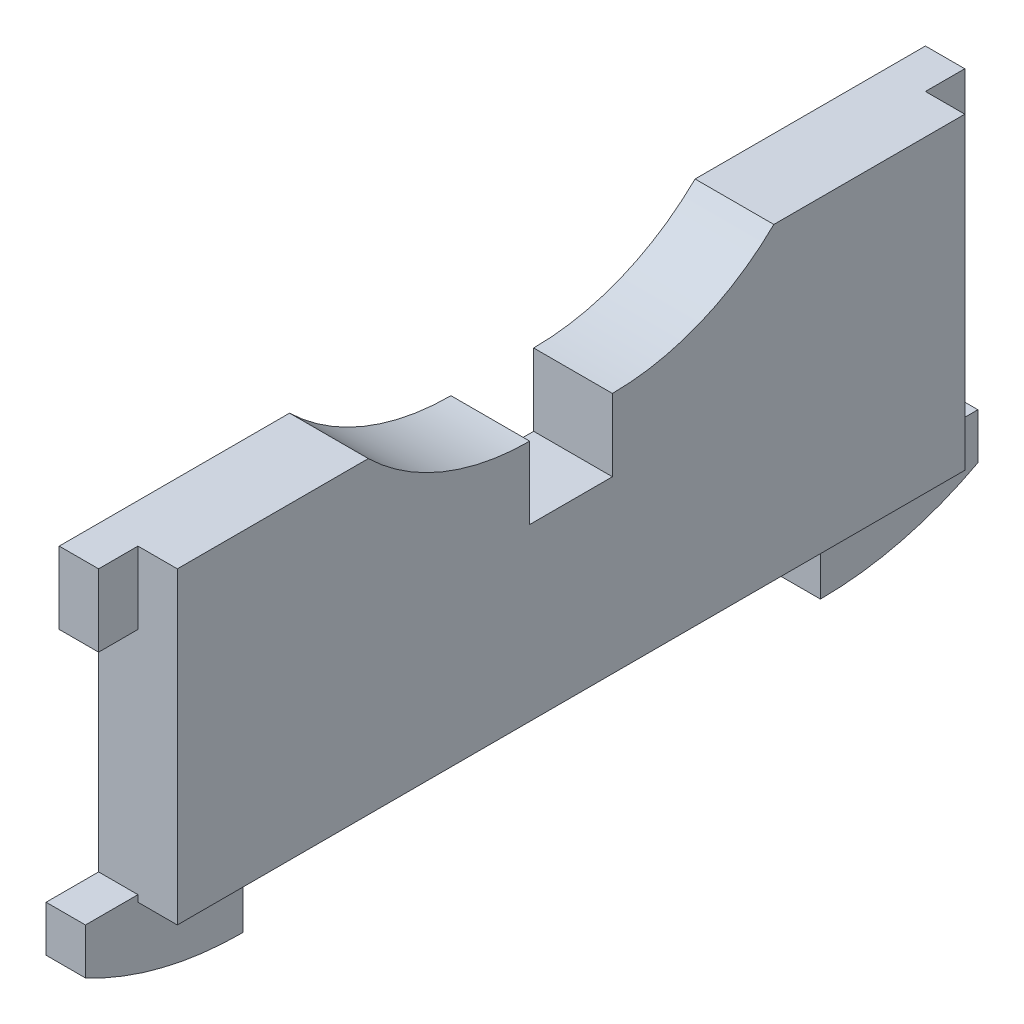
ISO-10303-21;
HEADER;
FILE_DESCRIPTION(('STEP AP214'),'2;1');
FILE_NAME('part.step','',(''),(''),'','','');
FILE_SCHEMA(('AUTOMOTIVE_DESIGN { 1 0 10303 214 1 1 1 1 }'));
ENDSEC;
DATA;
#1=APPLICATION_CONTEXT('core data for automotive mechanical design processes');
#2=APPLICATION_PROTOCOL_DEFINITION('international standard','automotive_design',2000,#1);
#3=PRODUCT_CONTEXT('',#1,'mechanical');
#4=PRODUCT('Part','Part','',(#3));
#5=PRODUCT_RELATED_PRODUCT_CATEGORY('part','',(#4));
#6=PRODUCT_DEFINITION_FORMATION('','',#4);
#7=PRODUCT_DEFINITION_CONTEXT('part definition',#1,'design');
#8=PRODUCT_DEFINITION('design','',#6,#7);
#9=PRODUCT_DEFINITION_SHAPE('','',#8);
#10=(LENGTH_UNIT() NAMED_UNIT(*) SI_UNIT(.MILLI.,.METRE.));
#11=(NAMED_UNIT(*) PLANE_ANGLE_UNIT() SI_UNIT($,.RADIAN.));
#12=(NAMED_UNIT(*) SI_UNIT($,.STERADIAN.) SOLID_ANGLE_UNIT());
#13=UNCERTAINTY_MEASURE_WITH_UNIT(LENGTH_MEASURE(1.E-05),#10,'distance_accuracy_value','');
#14=(GEOMETRIC_REPRESENTATION_CONTEXT(3) GLOBAL_UNCERTAINTY_ASSIGNED_CONTEXT((#13)) GLOBAL_UNIT_ASSIGNED_CONTEXT((#10,
#11,#12)) REPRESENTATION_CONTEXT('',''));
#15=CARTESIAN_POINT('',(0.,0.,0.));
#16=DIRECTION('',(0.,0.,1.));
#17=DIRECTION('',(1.,0.,0.));
#18=AXIS2_PLACEMENT_3D('',#15,#16,#17);
#19=CARTESIAN_POINT('',(3.,0.,-3.15));
#20=DIRECTION('',(0.,0.,-1.));
#21=DIRECTION('',(-1.,0.,0.));
#22=AXIS2_PLACEMENT_3D('',#19,#20,#21);
#23=PLANE('',#22);
#24=DIRECTION('',(-1.,0.,0.));
#25=VECTOR('',#24,1.);
#26=CARTESIAN_POINT('',(3.,5.50000000000001,-3.15));
#27=LINE('',#26,#25);
#28=CARTESIAN_POINT('',(3.,5.50000000000001,-3.15));
#29=VERTEX_POINT('',#28);
#30=CARTESIAN_POINT('',(-3.,5.50000000000001,-3.15));
#31=VERTEX_POINT('',#30);
#32=EDGE_CURVE('E562',#29,#31,#27,.T.);
#33=ORIENTED_EDGE('',*,*,#32,.T.);
#34=DIRECTION('',(0.,-1.,0.));
#35=VECTOR('',#34,1.);
#36=CARTESIAN_POINT('',(-3.,5.50000000000001,-3.15));
#37=LINE('',#36,#35);
#38=CARTESIAN_POINT('',(-3.,0.,-3.15));
#39=VERTEX_POINT('',#38);
#40=EDGE_CURVE('E488',#31,#39,#37,.T.);
#41=ORIENTED_EDGE('',*,*,#40,.T.);
#42=DIRECTION('',(-1.,0.,0.));
#43=VECTOR('',#42,1.);
#44=CARTESIAN_POINT('',(3.,0.,-3.15));
#45=LINE('',#44,#43);
#46=CARTESIAN_POINT('',(3.,0.,-3.15));
#47=VERTEX_POINT('',#46);
#48=EDGE_CURVE('E12',#47,#39,#45,.T.);
#49=ORIENTED_EDGE('',*,*,#48,.F.);
#50=DIRECTION('',(0.,-1.,0.));
#51=VECTOR('',#50,1.);
#52=CARTESIAN_POINT('',(3.,0.,-3.15));
#53=LINE('',#52,#51);
#54=EDGE_CURVE('E542',#29,#47,#53,.T.);
#55=ORIENTED_EDGE('',*,*,#54,.F.);
#56=EDGE_LOOP('',(#33,#41,#49,#55));
#57=FACE_BOUND('',#56,.T.);
#58=ADVANCED_FACE('F223',(#57),#23,.F.);
#59=CARTESIAN_POINT('',(3.,0.,3.15));
#60=DIRECTION('',(0.,-1.,0.));
#61=DIRECTION('',(0.,0.,-1.));
#62=AXIS2_PLACEMENT_3D('',#59,#60,#61);
#63=PLANE('',#62);
#64=ORIENTED_EDGE('',*,*,#48,.T.);
#65=DIRECTION('',(0.,0.,1.));
#66=VECTOR('',#65,1.);
#67=CARTESIAN_POINT('',(-3.,0.,-3.15));
#68=LINE('',#67,#66);
#69=CARTESIAN_POINT('',(-3.,0.,3.15));
#70=VERTEX_POINT('',#69);
#71=EDGE_CURVE('E491',#39,#70,#68,.T.);
#72=ORIENTED_EDGE('',*,*,#71,.T.);
#73=DIRECTION('',(-1.,0.,0.));
#74=VECTOR('',#73,1.);
#75=CARTESIAN_POINT('',(3.,0.,3.15));
#76=LINE('',#75,#74);
#77=CARTESIAN_POINT('',(3.,0.,3.15));
#78=VERTEX_POINT('',#77);
#79=EDGE_CURVE('E231',#78,#70,#76,.T.);
#80=ORIENTED_EDGE('',*,*,#79,.F.);
#81=DIRECTION('',(0.,0.,1.));
#82=VECTOR('',#81,1.);
#83=CARTESIAN_POINT('',(3.,0.,3.15));
#84=LINE('',#83,#82);
#85=EDGE_CURVE('E544',#47,#78,#84,.T.);
#86=ORIENTED_EDGE('',*,*,#85,.F.);
#87=EDGE_LOOP('',(#64,#72,#80,#86));
#88=FACE_BOUND('',#87,.T.);
#89=ADVANCED_FACE('F602',(#88),#63,.F.);
#90=CARTESIAN_POINT('',(3.,0.,3.15));
#91=DIRECTION('',(0.,0.,1.));
#92=DIRECTION('',(1.,0.,0.));
#93=AXIS2_PLACEMENT_3D('',#90,#91,#92);
#94=PLANE('',#93);
#95=ORIENTED_EDGE('',*,*,#79,.T.);
#96=DIRECTION('',(0.,1.,0.));
#97=VECTOR('',#96,1.);
#98=CARTESIAN_POINT('',(-3.,0.,3.15));
#99=LINE('',#98,#97);
#100=CARTESIAN_POINT('',(-3.,5.5,3.15));
#101=VERTEX_POINT('',#100);
#102=EDGE_CURVE('E494',#70,#101,#99,.T.);
#103=ORIENTED_EDGE('',*,*,#102,.T.);
#104=DIRECTION('',(-1.,0.,0.));
#105=VECTOR('',#104,1.);
#106=CARTESIAN_POINT('',(3.,5.5,3.15));
#107=LINE('',#106,#105);
#108=CARTESIAN_POINT('',(3.,5.5,3.15));
#109=VERTEX_POINT('',#108);
#110=EDGE_CURVE('E590',#109,#101,#107,.T.);
#111=ORIENTED_EDGE('',*,*,#110,.F.);
#112=DIRECTION('',(0.,1.,0.));
#113=VECTOR('',#112,1.);
#114=CARTESIAN_POINT('',(3.,0.,3.15));
#115=LINE('',#114,#113);
#116=EDGE_CURVE('E547',#78,#109,#115,.T.);
#117=ORIENTED_EDGE('',*,*,#116,.F.);
#118=EDGE_LOOP('',(#95,#103,#111,#117));
#119=FACE_BOUND('',#118,.T.);
#120=ADVANCED_FACE('F595',(#119),#94,.F.);
#121=CARTESIAN_POINT('',(3.,23.129,3.15));
#122=DIRECTION('',(-1.,0.,0.));
#123=DIRECTION('',(0.,0.,1.));
#124=AXIS2_PLACEMENT_3D('',#121,#122,#123);
#125=CYLINDRICAL_SURFACE('',#124,17.629);
#126=ORIENTED_EDGE('',*,*,#110,.T.);
#127=CARTESIAN_POINT('',(-3.,23.129,3.15));
#128=DIRECTION('',(-1.,0.,0.));
#129=DIRECTION('',(0.,0.,1.));
#130=AXIS2_PLACEMENT_3D('',#127,#128,#129);
#131=CIRCLE('',#130,17.629);
#132=CARTESIAN_POINT('',(-3.,10.5,15.45));
#133=VERTEX_POINT('',#132);
#134=EDGE_CURVE('E497',#101,#133,#131,.T.);
#135=ORIENTED_EDGE('',*,*,#134,.T.);
#136=DIRECTION('',(-1.,0.,0.));
#137=VECTOR('',#136,1.);
#138=CARTESIAN_POINT('',(3.,10.5,15.45));
#139=LINE('',#138,#137);
#140=CARTESIAN_POINT('',(3.,10.5,15.45));
#141=VERTEX_POINT('',#140);
#142=EDGE_CURVE('E588',#141,#133,#139,.T.);
#143=ORIENTED_EDGE('',*,*,#142,.F.);
#144=CARTESIAN_POINT('',(3.,23.129,3.15));
#145=DIRECTION('',(-1.,0.,0.));
#146=DIRECTION('',(0.,0.,1.));
#147=AXIS2_PLACEMENT_3D('',#144,#145,#146);
#148=CIRCLE('',#147,17.629);
#149=EDGE_CURVE('E549',#109,#141,#148,.T.);
#150=ORIENTED_EDGE('',*,*,#149,.F.);
#151=EDGE_LOOP('',(#126,#135,#143,#150));
#152=FACE_BOUND('',#151,.T.);
#153=ADVANCED_FACE('F675',(#152),#125,.F.);
#154=CARTESIAN_POINT('',(3.,10.5,15.45));
#155=DIRECTION('',(0.,-1.,0.));
#156=DIRECTION('',(0.,0.,-1.));
#157=AXIS2_PLACEMENT_3D('',#154,#155,#156);
#158=PLANE('',#157);
#159=ORIENTED_EDGE('',*,*,#142,.T.);
#160=DIRECTION('',(0.,0.,1.));
#161=VECTOR('',#160,1.);
#162=CARTESIAN_POINT('',(-3.,10.5,15.45));
#163=LINE('',#162,#161);
#164=CARTESIAN_POINT('',(-3.,10.5,33.));
#165=VERTEX_POINT('',#164);
#166=EDGE_CURVE('E500',#133,#165,#163,.T.);
#167=ORIENTED_EDGE('',*,*,#166,.T.);
#168=DIRECTION('',(1.,0.,0.));
#169=VECTOR('',#168,1.);
#170=CARTESIAN_POINT('',(-3.,10.5,33.));
#171=LINE('',#170,#169);
#172=CARTESIAN_POINT('',(0.,10.5,33.));
#173=VERTEX_POINT('',#172);
#174=EDGE_CURVE('E532',#165,#173,#171,.T.);
#175=ORIENTED_EDGE('',*,*,#174,.T.);
#176=DIRECTION('',(0.,0.,1.));
#177=VECTOR('',#176,1.);
#178=CARTESIAN_POINT('',(0.,10.5,15.45));
#179=LINE('',#178,#177);
#180=CARTESIAN_POINT('',(0.,10.5,30.));
#181=VERTEX_POINT('',#180);
#182=EDGE_CURVE('E478',#181,#173,#179,.T.);
#183=ORIENTED_EDGE('',*,*,#182,.F.);
#184=DIRECTION('',(-1.,0.,0.));
#185=VECTOR('',#184,1.);
#186=CARTESIAN_POINT('',(3.,10.5,30.));
#187=LINE('',#186,#185);
#188=CARTESIAN_POINT('',(3.,10.5,30.));
#189=VERTEX_POINT('',#188);
#190=EDGE_CURVE('E585',#189,#181,#187,.T.);
#191=ORIENTED_EDGE('',*,*,#190,.F.);
#192=DIRECTION('',(0.,0.,1.));
#193=VECTOR('',#192,1.);
#194=CARTESIAN_POINT('',(3.,10.5,15.45));
#195=LINE('',#194,#193);
#196=EDGE_CURVE('E551',#141,#189,#195,.T.);
#197=ORIENTED_EDGE('',*,*,#196,.F.);
#198=EDGE_LOOP('',(#159,#167,#175,#183,#191,#197));
#199=FACE_BOUND('',#198,.T.);
#200=ADVANCED_FACE('F669',(#199),#158,.F.);
#201=CARTESIAN_POINT('',(3.,10.5,30.));
#202=DIRECTION('',(0.,0.,-1.));
#203=DIRECTION('',(0.,1.,0.));
#204=AXIS2_PLACEMENT_3D('',#201,#202,#203);
#205=PLANE('',#204);
#206=DIRECTION('',(0.,-1.,0.));
#207=VECTOR('',#206,1.);
#208=CARTESIAN_POINT('',(0.,10.5,30.));
#209=LINE('',#208,#207);
#210=CARTESIAN_POINT('',(0.,5.,30.));
#211=VERTEX_POINT('',#210);
#212=EDGE_CURVE('E563',#181,#211,#209,.T.);
#213=ORIENTED_EDGE('',*,*,#212,.T.);
#214=DIRECTION('',(1.,0.,0.));
#215=VECTOR('',#214,1.);
#216=CARTESIAN_POINT('',(-3.,5.,30.));
#217=LINE('',#216,#215);
#218=CARTESIAN_POINT('',(-3.,5.,30.));
#219=VERTEX_POINT('',#218);
#220=EDGE_CURVE('E456',#219,#211,#217,.T.);
#221=ORIENTED_EDGE('',*,*,#220,.F.);
#222=DIRECTION('',(0.,-1.,0.));
#223=VECTOR('',#222,1.);
#224=CARTESIAN_POINT('',(-3.,10.5,30.));
#225=LINE('',#224,#223);
#226=CARTESIAN_POINT('',(-3.,-12.5,30.));
#227=VERTEX_POINT('',#226);
#228=EDGE_CURVE('E474',#219,#227,#225,.T.);
#229=ORIENTED_EDGE('',*,*,#228,.T.);
#230=DIRECTION('',(1.,0.,0.));
#231=VECTOR('',#230,1.);
#232=CARTESIAN_POINT('',(-3.,-12.5,30.));
#233=LINE('',#232,#231);
#234=CARTESIAN_POINT('',(0.,-12.5,30.));
#235=VERTEX_POINT('',#234);
#236=EDGE_CURVE('E465',#227,#235,#233,.T.);
#237=ORIENTED_EDGE('',*,*,#236,.T.);
#238=CARTESIAN_POINT('',(0.,-13.,30.));
#239=VERTEX_POINT('',#238);
#240=EDGE_CURVE('E401',#235,#239,#209,.T.);
#241=ORIENTED_EDGE('',*,*,#240,.T.);
#242=DIRECTION('',(-1.,0.,0.));
#243=VECTOR('',#242,1.);
#244=CARTESIAN_POINT('',(3.,-13.,30.));
#245=LINE('',#244,#243);
#246=CARTESIAN_POINT('',(3.,-13.,30.));
#247=VERTEX_POINT('',#246);
#248=EDGE_CURVE('E582',#247,#239,#245,.T.);
#249=ORIENTED_EDGE('',*,*,#248,.F.);
#250=DIRECTION('',(0.,-1.,0.));
#251=VECTOR('',#250,1.);
#252=CARTESIAN_POINT('',(3.,10.5,30.));
#253=LINE('',#252,#251);
#254=EDGE_CURVE('E553',#189,#247,#253,.T.);
#255=ORIENTED_EDGE('',*,*,#254,.F.);
#256=ORIENTED_EDGE('',*,*,#190,.T.);
#257=EDGE_LOOP('',(#213,#221,#229,#237,#241,#249,#255,#256));
#258=FACE_BOUND('',#257,.T.);
#259=ADVANCED_FACE('F657',(#258),#205,.F.);
#260=CARTESIAN_POINT('',(3.,-13.,-30.));
#261=DIRECTION('',(0.,1.,0.));
#262=DIRECTION('',(0.,0.,1.));
#263=AXIS2_PLACEMENT_3D('',#260,#261,#262);
#264=PLANE('',#263);
#265=DIRECTION('',(0.,0.,-1.));
#266=VECTOR('',#265,1.);
#267=CARTESIAN_POINT('',(0.,-13.,-30.));
#268=LINE('',#267,#266);
#269=CARTESIAN_POINT('',(0.,-13.,22.));
#270=VERTEX_POINT('',#269);
#271=EDGE_CURVE('E567',#239,#270,#268,.T.);
#272=ORIENTED_EDGE('',*,*,#271,.T.);
#273=DIRECTION('',(1.,0.,0.));
#274=VECTOR('',#273,1.);
#275=CARTESIAN_POINT('',(-3.,-13.,22.));
#276=LINE('',#275,#274);
#277=CARTESIAN_POINT('',(-3.,-13.,22.));
#278=VERTEX_POINT('',#277);
#279=EDGE_CURVE('E451',#278,#270,#276,.T.);
#280=ORIENTED_EDGE('',*,*,#279,.F.);
#281=DIRECTION('',(0.,0.,-1.));
#282=VECTOR('',#281,1.);
#283=CARTESIAN_POINT('',(-3.,-13.,30.));
#284=LINE('',#283,#282);
#285=CARTESIAN_POINT('',(-3.,-13.,-22.));
#286=VERTEX_POINT('',#285);
#287=EDGE_CURVE('E477',#278,#286,#284,.T.);
#288=ORIENTED_EDGE('',*,*,#287,.T.);
#289=DIRECTION('',(1.,0.,0.));
#290=VECTOR('',#289,1.);
#291=CARTESIAN_POINT('',(-3.,-13.,-22.));
#292=LINE('',#291,#290);
#293=CARTESIAN_POINT('',(0.,-13.,-22.));
#294=VERTEX_POINT('',#293);
#295=EDGE_CURVE('E402',#286,#294,#292,.T.);
#296=ORIENTED_EDGE('',*,*,#295,.T.);
#297=CARTESIAN_POINT('',(0.,-13.,-30.));
#298=VERTEX_POINT('',#297);
#299=EDGE_CURVE('E566',#294,#298,#268,.T.);
#300=ORIENTED_EDGE('',*,*,#299,.T.);
#301=DIRECTION('',(-1.,0.,0.));
#302=VECTOR('',#301,1.);
#303=CARTESIAN_POINT('',(3.,-13.,-30.));
#304=LINE('',#303,#302);
#305=CARTESIAN_POINT('',(3.,-13.,-30.));
#306=VERTEX_POINT('',#305);
#307=EDGE_CURVE('E579',#306,#298,#304,.T.);
#308=ORIENTED_EDGE('',*,*,#307,.F.);
#309=DIRECTION('',(0.,0.,-1.));
#310=VECTOR('',#309,1.);
#311=CARTESIAN_POINT('',(3.,-13.,-30.));
#312=LINE('',#311,#310);
#313=EDGE_CURVE('E555',#247,#306,#312,.T.);
#314=ORIENTED_EDGE('',*,*,#313,.F.);
#315=ORIENTED_EDGE('',*,*,#248,.T.);
#316=EDGE_LOOP('',(#272,#280,#288,#296,#300,#308,#314,#315));
#317=FACE_BOUND('',#316,.T.);
#318=ADVANCED_FACE('F637',(#317),#264,.F.);
#319=CARTESIAN_POINT('',(3.,10.5,-30.));
#320=DIRECTION('',(0.,0.,1.));
#321=DIRECTION('',(0.,-1.,0.));
#322=AXIS2_PLACEMENT_3D('',#319,#320,#321);
#323=PLANE('',#322);
#324=DIRECTION('',(0.,1.,0.));
#325=VECTOR('',#324,1.);
#326=CARTESIAN_POINT('',(0.,10.5,-30.));
#327=LINE('',#326,#325);
#328=CARTESIAN_POINT('',(0.,-12.5,-30.));
#329=VERTEX_POINT('',#328);
#330=EDGE_CURVE('E545',#298,#329,#327,.T.);
#331=ORIENTED_EDGE('',*,*,#330,.T.);
#332=DIRECTION('',(1.,0.,0.));
#333=VECTOR('',#332,1.);
#334=CARTESIAN_POINT('',(-3.,-12.5,-30.));
#335=LINE('',#334,#333);
#336=CARTESIAN_POINT('',(-3.,-12.5,-30.));
#337=VERTEX_POINT('',#336);
#338=EDGE_CURVE('E437',#337,#329,#335,.T.);
#339=ORIENTED_EDGE('',*,*,#338,.F.);
#340=DIRECTION('',(0.,1.,0.));
#341=VECTOR('',#340,1.);
#342=CARTESIAN_POINT('',(-3.,-13.,-30.));
#343=LINE('',#342,#341);
#344=CARTESIAN_POINT('',(-3.,5.,-30.));
#345=VERTEX_POINT('',#344);
#346=EDGE_CURVE('E480',#337,#345,#343,.T.);
#347=ORIENTED_EDGE('',*,*,#346,.T.);
#348=DIRECTION('',(1.,0.,0.));
#349=VECTOR('',#348,1.);
#350=CARTESIAN_POINT('',(-3.,5.,-30.));
#351=LINE('',#350,#349);
#352=CARTESIAN_POINT('',(0.,5.,-30.));
#353=VERTEX_POINT('',#352);
#354=EDGE_CURVE('E502',#345,#353,#351,.T.);
#355=ORIENTED_EDGE('',*,*,#354,.T.);
#356=CARTESIAN_POINT('',(0.,10.5,-30.));
#357=VERTEX_POINT('',#356);
#358=EDGE_CURVE('E570',#353,#357,#327,.T.);
#359=ORIENTED_EDGE('',*,*,#358,.T.);
#360=DIRECTION('',(-1.,0.,0.));
#361=VECTOR('',#360,1.);
#362=CARTESIAN_POINT('',(3.,10.5,-30.));
#363=LINE('',#362,#361);
#364=CARTESIAN_POINT('',(3.,10.5,-30.));
#365=VERTEX_POINT('',#364);
#366=EDGE_CURVE('E576',#365,#357,#363,.T.);
#367=ORIENTED_EDGE('',*,*,#366,.F.);
#368=DIRECTION('',(0.,1.,0.));
#369=VECTOR('',#368,1.);
#370=CARTESIAN_POINT('',(3.,10.5,-30.));
#371=LINE('',#370,#369);
#372=EDGE_CURVE('E557',#306,#365,#371,.T.);
#373=ORIENTED_EDGE('',*,*,#372,.F.);
#374=ORIENTED_EDGE('',*,*,#307,.T.);
#375=EDGE_LOOP('',(#331,#339,#347,#355,#359,#367,#373,#374));
#376=FACE_BOUND('',#375,.T.);
#377=ADVANCED_FACE('F683',(#376),#323,.F.);
#378=CARTESIAN_POINT('',(3.,10.5,-15.45));
#379=DIRECTION('',(0.,-1.,0.));
#380=DIRECTION('',(0.,0.,-1.));
#381=AXIS2_PLACEMENT_3D('',#378,#379,#380);
#382=PLANE('',#381);
#383=ORIENTED_EDGE('',*,*,#366,.T.);
#384=DIRECTION('',(0.,0.,1.));
#385=VECTOR('',#384,1.);
#386=CARTESIAN_POINT('',(0.,10.5,-30.));
#387=LINE('',#386,#385);
#388=CARTESIAN_POINT('',(0.,10.5,-33.));
#389=VERTEX_POINT('',#388);
#390=EDGE_CURVE('E503',#389,#357,#387,.T.);
#391=ORIENTED_EDGE('',*,*,#390,.F.);
#392=DIRECTION('',(1.,0.,0.));
#393=VECTOR('',#392,1.);
#394=CARTESIAN_POINT('',(-3.,10.5,-33.));
#395=LINE('',#394,#393);
#396=CARTESIAN_POINT('',(-3.,10.5,-33.));
#397=VERTEX_POINT('',#396);
#398=EDGE_CURVE('E505',#397,#389,#395,.T.);
#399=ORIENTED_EDGE('',*,*,#398,.F.);
#400=DIRECTION('',(0.,0.,1.));
#401=VECTOR('',#400,1.);
#402=CARTESIAN_POINT('',(-3.,10.5,-30.));
#403=LINE('',#402,#401);
#404=CARTESIAN_POINT('',(-3.,10.5,-15.45));
#405=VERTEX_POINT('',#404);
#406=EDGE_CURVE('E482',#397,#405,#403,.T.);
#407=ORIENTED_EDGE('',*,*,#406,.T.);
#408=DIRECTION('',(-1.,0.,0.));
#409=VECTOR('',#408,1.);
#410=CARTESIAN_POINT('',(3.,10.5,-15.45));
#411=LINE('',#410,#409);
#412=CARTESIAN_POINT('',(3.,10.5,-15.45));
#413=VERTEX_POINT('',#412);
#414=EDGE_CURVE('E574',#413,#405,#411,.T.);
#415=ORIENTED_EDGE('',*,*,#414,.F.);
#416=DIRECTION('',(0.,0.,1.));
#417=VECTOR('',#416,1.);
#418=CARTESIAN_POINT('',(3.,10.5,-15.45));
#419=LINE('',#418,#417);
#420=EDGE_CURVE('E559',#365,#413,#419,.T.);
#421=ORIENTED_EDGE('',*,*,#420,.F.);
#422=EDGE_LOOP('',(#383,#391,#399,#407,#415,#421));
#423=FACE_BOUND('',#422,.T.);
#424=ADVANCED_FACE('F612',(#423),#382,.F.);
#425=CARTESIAN_POINT('',(3.,23.129,-3.15));
#426=DIRECTION('',(-1.,0.,0.));
#427=DIRECTION('',(0.,0.,1.));
#428=AXIS2_PLACEMENT_3D('',#425,#426,#427);
#429=CYLINDRICAL_SURFACE('',#428,17.629);
#430=ORIENTED_EDGE('',*,*,#414,.T.);
#431=CARTESIAN_POINT('',(-3.,23.129,-3.15));
#432=DIRECTION('',(-1.,0.,0.));
#433=DIRECTION('',(0.,0.,1.));
#434=AXIS2_PLACEMENT_3D('',#431,#432,#433);
#435=CIRCLE('',#434,17.629);
#436=EDGE_CURVE('E485',#405,#31,#435,.T.);
#437=ORIENTED_EDGE('',*,*,#436,.T.);
#438=ORIENTED_EDGE('',*,*,#32,.F.);
#439=CARTESIAN_POINT('',(3.,23.129,-3.15));
#440=DIRECTION('',(-1.,0.,0.));
#441=DIRECTION('',(0.,0.,-1.));
#442=AXIS2_PLACEMENT_3D('',#439,#440,#441);
#443=CIRCLE('',#442,17.629);
#444=EDGE_CURVE('E238',#413,#29,#443,.T.);
#445=ORIENTED_EDGE('',*,*,#444,.F.);
#446=EDGE_LOOP('',(#430,#437,#438,#445));
#447=FACE_BOUND('',#446,.T.);
#448=ADVANCED_FACE('F608',(#447),#429,.F.);
#449=CARTESIAN_POINT('',(3.,23.129,-3.15));
#450=DIRECTION('',(1.,0.,0.));
#451=DIRECTION('',(0.,0.,-1.));
#452=AXIS2_PLACEMENT_3D('',#449,#450,#451);
#453=PLANE('',#452);
#454=ORIENTED_EDGE('',*,*,#54,.T.);
#455=ORIENTED_EDGE('',*,*,#85,.T.);
#456=ORIENTED_EDGE('',*,*,#116,.T.);
#457=ORIENTED_EDGE('',*,*,#149,.T.);
#458=ORIENTED_EDGE('',*,*,#196,.T.);
#459=ORIENTED_EDGE('',*,*,#254,.T.);
#460=ORIENTED_EDGE('',*,*,#313,.T.);
#461=ORIENTED_EDGE('',*,*,#372,.T.);
#462=ORIENTED_EDGE('',*,*,#420,.T.);
#463=ORIENTED_EDGE('',*,*,#444,.T.);
#464=EDGE_LOOP('',(#454,#455,#456,#457,#458,#459,#460,#461,#462,#463));
#465=FACE_BOUND('',#464,.T.);
#466=ADVANCED_FACE('F676',(#465),#453,.T.);
#467=CARTESIAN_POINT('',(0.,0.,0.));
#468=DIRECTION('',(-1.,0.,0.));
#469=DIRECTION('',(0.,0.,1.));
#470=AXIS2_PLACEMENT_3D('',#467,#468,#469);
#471=PLANE('',#470);
#472=ORIENTED_EDGE('',*,*,#358,.F.);
#473=DIRECTION('',(0.,0.,1.));
#474=VECTOR('',#473,1.);
#475=CARTESIAN_POINT('',(0.,5.,-33.));
#476=LINE('',#475,#474);
#477=CARTESIAN_POINT('',(0.,5.,-33.));
#478=VERTEX_POINT('',#477);
#479=EDGE_CURVE('E510',#478,#353,#476,.T.);
#480=ORIENTED_EDGE('',*,*,#479,.F.);
#481=DIRECTION('',(0.,-1.,0.));
#482=VECTOR('',#481,1.);
#483=CARTESIAN_POINT('',(0.,10.5,-33.));
#484=LINE('',#483,#482);
#485=EDGE_CURVE('E514',#389,#478,#484,.T.);
#486=ORIENTED_EDGE('',*,*,#485,.F.);
#487=ORIENTED_EDGE('',*,*,#390,.T.);
#488=EDGE_LOOP('',(#472,#480,#486,#487));
#489=FACE_BOUND('',#488,.T.);
#490=ADVANCED_FACE('F685',(#489),#471,.F.);
#491=ORIENTED_EDGE('',*,*,#330,.F.);
#492=ORIENTED_EDGE('',*,*,#299,.F.);
#493=DIRECTION('',(0.,-1.,0.));
#494=VECTOR('',#493,1.);
#495=CARTESIAN_POINT('',(0.,0.,-22.));
#496=LINE('',#495,#494);
#497=CARTESIAN_POINT('',(0.,-19.,-22.));
#498=VERTEX_POINT('',#497);
#499=EDGE_CURVE('E426',#294,#498,#496,.T.);
#500=ORIENTED_EDGE('',*,*,#499,.T.);
#501=CARTESIAN_POINT('',(0.,6.49999999999999,-22.));
#502=DIRECTION('',(-1.,0.,0.));
#503=DIRECTION('',(0.,0.,1.));
#504=AXIS2_PLACEMENT_3D('',#501,#502,#503);
#505=CIRCLE('',#504,25.5);
#506=CARTESIAN_POINT('',(0.,-16.,-34.));
#507=VERTEX_POINT('',#506);
#508=EDGE_CURVE('E396',#498,#507,#505,.F.);
#509=ORIENTED_EDGE('',*,*,#508,.T.);
#510=DIRECTION('',(0.,1.,0.));
#511=VECTOR('',#510,1.);
#512=CARTESIAN_POINT('',(0.,0.,-34.));
#513=LINE('',#512,#511);
#514=CARTESIAN_POINT('',(0.,-12.5,-34.));
#515=VERTEX_POINT('',#514);
#516=EDGE_CURVE('E413',#507,#515,#513,.T.);
#517=ORIENTED_EDGE('',*,*,#516,.T.);
#518=DIRECTION('',(0.,0.,1.));
#519=VECTOR('',#518,1.);
#520=CARTESIAN_POINT('',(0.,-12.5,0.));
#521=LINE('',#520,#519);
#522=EDGE_CURVE('E429',#515,#329,#521,.T.);
#523=ORIENTED_EDGE('',*,*,#522,.T.);
#524=EDGE_LOOP('',(#491,#492,#500,#509,#517,#523));
#525=FACE_BOUND('',#524,.T.);
#526=ADVANCED_FACE('F633',(#525),#471,.F.);
#527=ORIENTED_EDGE('',*,*,#212,.F.);
#528=ORIENTED_EDGE('',*,*,#182,.T.);
#529=DIRECTION('',(0.,-1.,0.));
#530=VECTOR('',#529,1.);
#531=CARTESIAN_POINT('',(0.,10.5,33.));
#532=LINE('',#531,#530);
#533=CARTESIAN_POINT('',(0.,5.,33.));
#534=VERTEX_POINT('',#533);
#535=EDGE_CURVE('E533',#173,#534,#532,.T.);
#536=ORIENTED_EDGE('',*,*,#535,.T.);
#537=DIRECTION('',(0.,0.,-1.));
#538=VECTOR('',#537,1.);
#539=CARTESIAN_POINT('',(0.,5.,33.));
#540=LINE('',#539,#538);
#541=EDGE_CURVE('E529',#534,#211,#540,.T.);
#542=ORIENTED_EDGE('',*,*,#541,.T.);
#543=EDGE_LOOP('',(#527,#528,#536,#542));
#544=FACE_BOUND('',#543,.T.);
#545=ADVANCED_FACE('F693',(#544),#471,.F.);
#546=CARTESIAN_POINT('',(-3.,0.,-22.));
#547=DIRECTION('',(0.,0.,1.));
#548=DIRECTION('',(0.,-1.,0.));
#549=AXIS2_PLACEMENT_3D('',#546,#547,#548);
#550=PLANE('',#549);
#551=ORIENTED_EDGE('',*,*,#499,.F.);
#552=ORIENTED_EDGE('',*,*,#295,.F.);
#553=DIRECTION('',(0.,-1.,0.));
#554=VECTOR('',#553,1.);
#555=CARTESIAN_POINT('',(-3.,0.,-22.));
#556=LINE('',#555,#554);
#557=CARTESIAN_POINT('',(-3.,-19.,-22.));
#558=VERTEX_POINT('',#557);
#559=EDGE_CURVE('E409',#286,#558,#556,.T.);
#560=ORIENTED_EDGE('',*,*,#559,.T.);
#561=DIRECTION('',(1.,0.,0.));
#562=VECTOR('',#561,1.);
#563=CARTESIAN_POINT('',(-3.,-19.,-22.));
#564=LINE('',#563,#562);
#565=EDGE_CURVE('E390',#558,#498,#564,.T.);
#566=ORIENTED_EDGE('',*,*,#565,.T.);
#567=EDGE_LOOP('',(#551,#552,#560,#566));
#568=FACE_BOUND('',#567,.T.);
#569=ADVANCED_FACE('F415',(#568),#550,.T.);
#570=CARTESIAN_POINT('',(-3.,-12.5,0.));
#571=DIRECTION('',(0.,1.,0.));
#572=DIRECTION('',(0.,0.,1.));
#573=AXIS2_PLACEMENT_3D('',#570,#571,#572);
#574=PLANE('',#573);
#575=ORIENTED_EDGE('',*,*,#522,.F.);
#576=DIRECTION('',(1.,0.,0.));
#577=VECTOR('',#576,1.);
#578=CARTESIAN_POINT('',(-3.,-12.5,-34.));
#579=LINE('',#578,#577);
#580=CARTESIAN_POINT('',(-3.,-12.5,-34.));
#581=VERTEX_POINT('',#580);
#582=EDGE_CURVE('E435',#581,#515,#579,.T.);
#583=ORIENTED_EDGE('',*,*,#582,.F.);
#584=DIRECTION('',(0.,0.,1.));
#585=VECTOR('',#584,1.);
#586=CARTESIAN_POINT('',(-3.,-12.5,0.));
#587=LINE('',#586,#585);
#588=EDGE_CURVE('E418',#581,#337,#587,.T.);
#589=ORIENTED_EDGE('',*,*,#588,.T.);
#590=ORIENTED_EDGE('',*,*,#338,.T.);
#591=EDGE_LOOP('',(#575,#583,#589,#590));
#592=FACE_BOUND('',#591,.T.);
#593=ADVANCED_FACE('F628',(#592),#574,.T.);
#594=CARTESIAN_POINT('',(-3.,0.,-34.));
#595=DIRECTION('',(0.,0.,-1.));
#596=DIRECTION('',(-1.,0.,0.));
#597=AXIS2_PLACEMENT_3D('',#594,#595,#596);
#598=PLANE('',#597);
#599=ORIENTED_EDGE('',*,*,#516,.F.);
#600=DIRECTION('',(1.,0.,0.));
#601=VECTOR('',#600,1.);
#602=CARTESIAN_POINT('',(-3.,-16.,-34.));
#603=LINE('',#602,#601);
#604=CARTESIAN_POINT('',(-3.,-16.,-34.));
#605=VERTEX_POINT('',#604);
#606=EDGE_CURVE('E424',#605,#507,#603,.T.);
#607=ORIENTED_EDGE('',*,*,#606,.F.);
#608=DIRECTION('',(0.,1.,0.));
#609=VECTOR('',#608,1.);
#610=CARTESIAN_POINT('',(-3.,0.,-34.));
#611=LINE('',#610,#609);
#612=EDGE_CURVE('E412',#605,#581,#611,.T.);
#613=ORIENTED_EDGE('',*,*,#612,.T.);
#614=ORIENTED_EDGE('',*,*,#582,.T.);
#615=EDGE_LOOP('',(#599,#607,#613,#614));
#616=FACE_BOUND('',#615,.T.);
#617=ADVANCED_FACE('F631',(#616),#598,.T.);
#618=CARTESIAN_POINT('',(-3.,6.49999999999999,-22.));
#619=DIRECTION('',(1.,0.,0.));
#620=DIRECTION('',(0.,0.,-1.));
#621=AXIS2_PLACEMENT_3D('',#618,#619,#620);
#622=CYLINDRICAL_SURFACE('',#621,25.5);
#623=ORIENTED_EDGE('',*,*,#508,.F.);
#624=ORIENTED_EDGE('',*,*,#565,.F.);
#625=CARTESIAN_POINT('',(-3.,6.49999999999999,-22.));
#626=DIRECTION('',(-1.,0.,0.));
#627=DIRECTION('',(0.,0.,1.));
#628=AXIS2_PLACEMENT_3D('',#625,#626,#627);
#629=CIRCLE('',#628,25.5);
#630=EDGE_CURVE('E393',#558,#605,#629,.F.);
#631=ORIENTED_EDGE('',*,*,#630,.T.);
#632=ORIENTED_EDGE('',*,*,#606,.T.);
#633=EDGE_LOOP('',(#623,#624,#631,#632));
#634=FACE_BOUND('',#633,.T.);
#635=ADVANCED_FACE('F392',(#634),#622,.T.);
#636=ORIENTED_EDGE('',*,*,#271,.F.);
#637=ORIENTED_EDGE('',*,*,#240,.F.);
#638=DIRECTION('',(0.,0.,-1.));
#639=VECTOR('',#638,1.);
#640=CARTESIAN_POINT('',(0.,-12.5,0.));
#641=LINE('',#640,#639);
#642=CARTESIAN_POINT('',(0.,-12.5,34.));
#643=VERTEX_POINT('',#642);
#644=EDGE_CURVE('E444',#643,#235,#641,.T.);
#645=ORIENTED_EDGE('',*,*,#644,.F.);
#646=DIRECTION('',(0.,-1.,0.));
#647=VECTOR('',#646,1.);
#648=CARTESIAN_POINT('',(0.,0.,34.));
#649=LINE('',#648,#647);
#650=CARTESIAN_POINT('',(0.,-16.,34.));
#651=VERTEX_POINT('',#650);
#652=EDGE_CURVE('E459',#643,#651,#649,.T.);
#653=ORIENTED_EDGE('',*,*,#652,.T.);
#654=CARTESIAN_POINT('',(0.,6.5,22.));
#655=DIRECTION('',(-1.,0.,0.));
#656=DIRECTION('',(0.,0.,1.));
#657=AXIS2_PLACEMENT_3D('',#654,#655,#656);
#658=CIRCLE('',#657,25.5);
#659=CARTESIAN_POINT('',(0.,-19.,22.));
#660=VERTEX_POINT('',#659);
#661=EDGE_CURVE('E455',#660,#651,#658,.T.);
#662=ORIENTED_EDGE('',*,*,#661,.F.);
#663=DIRECTION('',(0.,-1.,0.));
#664=VECTOR('',#663,1.);
#665=CARTESIAN_POINT('',(0.,0.,22.));
#666=LINE('',#665,#664);
#667=EDGE_CURVE('E452',#270,#660,#666,.T.);
#668=ORIENTED_EDGE('',*,*,#667,.F.);
#669=EDGE_LOOP('',(#636,#637,#645,#653,#662,#668));
#670=FACE_BOUND('',#669,.T.);
#671=ADVANCED_FACE('F688',(#670),#471,.F.);
#672=CARTESIAN_POINT('',(-3.,0.,0.));
#673=DIRECTION('',(-1.,0.,0.));
#674=DIRECTION('',(0.,0.,1.));
#675=AXIS2_PLACEMENT_3D('',#672,#673,#674);
#676=PLANE('',#675);
#677=DIRECTION('',(0.,0.,-1.));
#678=VECTOR('',#677,1.);
#679=CARTESIAN_POINT('',(-3.,-12.5,0.));
#680=LINE('',#679,#678);
#681=CARTESIAN_POINT('',(-3.,-12.5,34.));
#682=VERTEX_POINT('',#681);
#683=EDGE_CURVE('E449',#682,#227,#680,.T.);
#684=ORIENTED_EDGE('',*,*,#683,.T.);
#685=ORIENTED_EDGE('',*,*,#228,.F.);
#686=DIRECTION('',(0.,0.,-1.));
#687=VECTOR('',#686,1.);
#688=CARTESIAN_POINT('',(-3.,5.,33.));
#689=LINE('',#688,#687);
#690=CARTESIAN_POINT('',(-3.,5.,33.));
#691=VERTEX_POINT('',#690);
#692=EDGE_CURVE('E528',#691,#219,#689,.T.);
#693=ORIENTED_EDGE('',*,*,#692,.F.);
#694=DIRECTION('',(0.,-1.,0.));
#695=VECTOR('',#694,1.);
#696=CARTESIAN_POINT('',(-3.,10.5,33.));
#697=LINE('',#696,#695);
#698=EDGE_CURVE('E525',#165,#691,#697,.T.);
#699=ORIENTED_EDGE('',*,*,#698,.F.);
#700=ORIENTED_EDGE('',*,*,#166,.F.);
#701=ORIENTED_EDGE('',*,*,#134,.F.);
#702=ORIENTED_EDGE('',*,*,#102,.F.);
#703=ORIENTED_EDGE('',*,*,#71,.F.);
#704=ORIENTED_EDGE('',*,*,#40,.F.);
#705=ORIENTED_EDGE('',*,*,#436,.F.);
#706=ORIENTED_EDGE('',*,*,#406,.F.);
#707=DIRECTION('',(0.,-1.,0.));
#708=VECTOR('',#707,1.);
#709=CARTESIAN_POINT('',(-3.,10.5,-33.));
#710=LINE('',#709,#708);
#711=CARTESIAN_POINT('',(-3.,5.,-33.));
#712=VERTEX_POINT('',#711);
#713=EDGE_CURVE('E507',#397,#712,#710,.T.);
#714=ORIENTED_EDGE('',*,*,#713,.T.);
#715=DIRECTION('',(0.,0.,1.));
#716=VECTOR('',#715,1.);
#717=CARTESIAN_POINT('',(-3.,5.,-33.));
#718=LINE('',#717,#716);
#719=EDGE_CURVE('E509',#712,#345,#718,.T.);
#720=ORIENTED_EDGE('',*,*,#719,.T.);
#721=ORIENTED_EDGE('',*,*,#346,.F.);
#722=ORIENTED_EDGE('',*,*,#588,.F.);
#723=ORIENTED_EDGE('',*,*,#612,.F.);
#724=ORIENTED_EDGE('',*,*,#630,.F.);
#725=ORIENTED_EDGE('',*,*,#559,.F.);
#726=ORIENTED_EDGE('',*,*,#287,.F.);
#727=DIRECTION('',(0.,-1.,0.));
#728=VECTOR('',#727,1.);
#729=CARTESIAN_POINT('',(-3.,0.,22.));
#730=LINE('',#729,#728);
#731=CARTESIAN_POINT('',(-3.,-19.,22.));
#732=VERTEX_POINT('',#731);
#733=EDGE_CURVE('E440',#278,#732,#730,.T.);
#734=ORIENTED_EDGE('',*,*,#733,.T.);
#735=CARTESIAN_POINT('',(-3.,6.5,22.));
#736=DIRECTION('',(-1.,0.,0.));
#737=DIRECTION('',(0.,0.,1.));
#738=AXIS2_PLACEMENT_3D('',#735,#736,#737);
#739=CIRCLE('',#738,25.5);
#740=CARTESIAN_POINT('',(-3.,-16.,34.));
#741=VERTEX_POINT('',#740);
#742=EDGE_CURVE('E443',#732,#741,#739,.T.);
#743=ORIENTED_EDGE('',*,*,#742,.T.);
#744=DIRECTION('',(0.,-1.,0.));
#745=VECTOR('',#744,1.);
#746=CARTESIAN_POINT('',(-3.,0.,34.));
#747=LINE('',#746,#745);
#748=EDGE_CURVE('E446',#682,#741,#747,.T.);
#749=ORIENTED_EDGE('',*,*,#748,.F.);
#750=EDGE_LOOP('',(#684,#685,#693,#699,#700,#701,#702,#703,#704,#705,#706,#714,#720,#721,#722,
#723,#724,#725,#726,#734,#743,#749));
#751=FACE_BOUND('',#750,.T.);
#752=ADVANCED_FACE('F407',(#751),#676,.T.);
#753=CARTESIAN_POINT('',(-3.,10.5,-33.));
#754=DIRECTION('',(0.,0.,1.));
#755=DIRECTION('',(1.,0.,0.));
#756=AXIS2_PLACEMENT_3D('',#753,#754,#755);
#757=PLANE('',#756);
#758=ORIENTED_EDGE('',*,*,#485,.T.);
#759=DIRECTION('',(1.,0.,0.));
#760=VECTOR('',#759,1.);
#761=CARTESIAN_POINT('',(-3.,5.,-33.));
#762=LINE('',#761,#760);
#763=EDGE_CURVE('E513',#712,#478,#762,.T.);
#764=ORIENTED_EDGE('',*,*,#763,.F.);
#765=ORIENTED_EDGE('',*,*,#713,.F.);
#766=ORIENTED_EDGE('',*,*,#398,.T.);
#767=EDGE_LOOP('',(#758,#764,#765,#766));
#768=FACE_BOUND('',#767,.T.);
#769=ADVANCED_FACE('F617',(#768),#757,.F.);
#770=CARTESIAN_POINT('',(-3.,6.5,22.));
#771=DIRECTION('',(1.,0.,0.));
#772=DIRECTION('',(0.,0.,-1.));
#773=AXIS2_PLACEMENT_3D('',#770,#771,#772);
#774=CYLINDRICAL_SURFACE('',#773,25.5);
#775=ORIENTED_EDGE('',*,*,#661,.T.);
#776=DIRECTION('',(1.,0.,0.));
#777=VECTOR('',#776,1.);
#778=CARTESIAN_POINT('',(-3.,-16.,34.));
#779=LINE('',#778,#777);
#780=EDGE_CURVE('E470',#741,#651,#779,.T.);
#781=ORIENTED_EDGE('',*,*,#780,.F.);
#782=ORIENTED_EDGE('',*,*,#742,.F.);
#783=DIRECTION('',(1.,0.,0.));
#784=VECTOR('',#783,1.);
#785=CARTESIAN_POINT('',(-3.,-19.,22.));
#786=LINE('',#785,#784);
#787=EDGE_CURVE('E427',#732,#660,#786,.T.);
#788=ORIENTED_EDGE('',*,*,#787,.T.);
#789=EDGE_LOOP('',(#775,#781,#782,#788));
#790=FACE_BOUND('',#789,.T.);
#791=ADVANCED_FACE('F644',(#790),#774,.T.);
#792=CARTESIAN_POINT('',(-3.,0.,34.));
#793=DIRECTION('',(0.,0.,1.));
#794=DIRECTION('',(1.,0.,0.));
#795=AXIS2_PLACEMENT_3D('',#792,#793,#794);
#796=PLANE('',#795);
#797=ORIENTED_EDGE('',*,*,#652,.F.);
#798=DIRECTION('',(1.,0.,0.));
#799=VECTOR('',#798,1.);
#800=CARTESIAN_POINT('',(-3.,-12.5,34.));
#801=LINE('',#800,#799);
#802=EDGE_CURVE('E468',#682,#643,#801,.T.);
#803=ORIENTED_EDGE('',*,*,#802,.F.);
#804=ORIENTED_EDGE('',*,*,#748,.T.);
#805=ORIENTED_EDGE('',*,*,#780,.T.);
#806=EDGE_LOOP('',(#797,#803,#804,#805));
#807=FACE_BOUND('',#806,.T.);
#808=ADVANCED_FACE('F651',(#807),#796,.T.);
#809=CARTESIAN_POINT('',(-3.,-12.5,0.));
#810=DIRECTION('',(0.,-1.,0.));
#811=DIRECTION('',(0.,0.,-1.));
#812=AXIS2_PLACEMENT_3D('',#809,#810,#811);
#813=PLANE('',#812);
#814=ORIENTED_EDGE('',*,*,#644,.T.);
#815=ORIENTED_EDGE('',*,*,#236,.F.);
#816=ORIENTED_EDGE('',*,*,#683,.F.);
#817=ORIENTED_EDGE('',*,*,#802,.T.);
#818=EDGE_LOOP('',(#814,#815,#816,#817));
#819=FACE_BOUND('',#818,.T.);
#820=ADVANCED_FACE('F654',(#819),#813,.F.);
#821=CARTESIAN_POINT('',(-3.,5.,33.));
#822=DIRECTION('',(0.,-1.,0.));
#823=DIRECTION('',(0.,0.,-1.));
#824=AXIS2_PLACEMENT_3D('',#821,#822,#823);
#825=PLANE('',#824);
#826=ORIENTED_EDGE('',*,*,#541,.F.);
#827=DIRECTION('',(1.,0.,0.));
#828=VECTOR('',#827,1.);
#829=CARTESIAN_POINT('',(-3.,5.,33.));
#830=LINE('',#829,#828);
#831=EDGE_CURVE('E516',#691,#534,#830,.T.);
#832=ORIENTED_EDGE('',*,*,#831,.F.);
#833=ORIENTED_EDGE('',*,*,#692,.T.);
#834=ORIENTED_EDGE('',*,*,#220,.T.);
#835=EDGE_LOOP('',(#826,#832,#833,#834));
#836=FACE_BOUND('',#835,.T.);
#837=ADVANCED_FACE('F662',(#836),#825,.T.);
#838=CARTESIAN_POINT('',(-3.,10.5,33.));
#839=DIRECTION('',(0.,0.,1.));
#840=DIRECTION('',(1.,0.,0.));
#841=AXIS2_PLACEMENT_3D('',#838,#839,#840);
#842=PLANE('',#841);
#843=ORIENTED_EDGE('',*,*,#535,.F.);
#844=ORIENTED_EDGE('',*,*,#174,.F.);
#845=ORIENTED_EDGE('',*,*,#698,.T.);
#846=ORIENTED_EDGE('',*,*,#831,.T.);
#847=EDGE_LOOP('',(#843,#844,#845,#846));
#848=FACE_BOUND('',#847,.T.);
#849=ADVANCED_FACE('F666',(#848),#842,.T.);
#850=CARTESIAN_POINT('',(-3.,0.,22.));
#851=DIRECTION('',(0.,0.,1.));
#852=DIRECTION('',(1.,0.,0.));
#853=AXIS2_PLACEMENT_3D('',#850,#851,#852);
#854=PLANE('',#853);
#855=ORIENTED_EDGE('',*,*,#667,.T.);
#856=ORIENTED_EDGE('',*,*,#787,.F.);
#857=ORIENTED_EDGE('',*,*,#733,.F.);
#858=ORIENTED_EDGE('',*,*,#279,.T.);
#859=EDGE_LOOP('',(#855,#856,#857,#858));
#860=FACE_BOUND('',#859,.T.);
#861=ADVANCED_FACE('F641',(#860),#854,.F.);
#862=CARTESIAN_POINT('',(-3.,5.,-33.));
#863=DIRECTION('',(0.,1.,0.));
#864=DIRECTION('',(0.,0.,1.));
#865=AXIS2_PLACEMENT_3D('',#862,#863,#864);
#866=PLANE('',#865);
#867=ORIENTED_EDGE('',*,*,#479,.T.);
#868=ORIENTED_EDGE('',*,*,#354,.F.);
#869=ORIENTED_EDGE('',*,*,#719,.F.);
#870=ORIENTED_EDGE('',*,*,#763,.T.);
#871=EDGE_LOOP('',(#867,#868,#869,#870));
#872=FACE_BOUND('',#871,.T.);
#873=ADVANCED_FACE('F623',(#872),#866,.F.);
#874=CLOSED_SHELL('',(#58,#89,#120,#153,#200,#259,#318,#377,#424,#448,#466,#490,#526,#545,#569,
#593,#617,#635,#671,#752,#769,#791,#808,#820,#837,#849,#861,#873));
#875=MANIFOLD_SOLID_BREP('B2',#874);
#876=ADVANCED_BREP_SHAPE_REPRESENTATION('',(#18,#875),#14);
#877=SHAPE_DEFINITION_REPRESENTATION(#9,#876);
ENDSEC;
END-ISO-10303-21;
